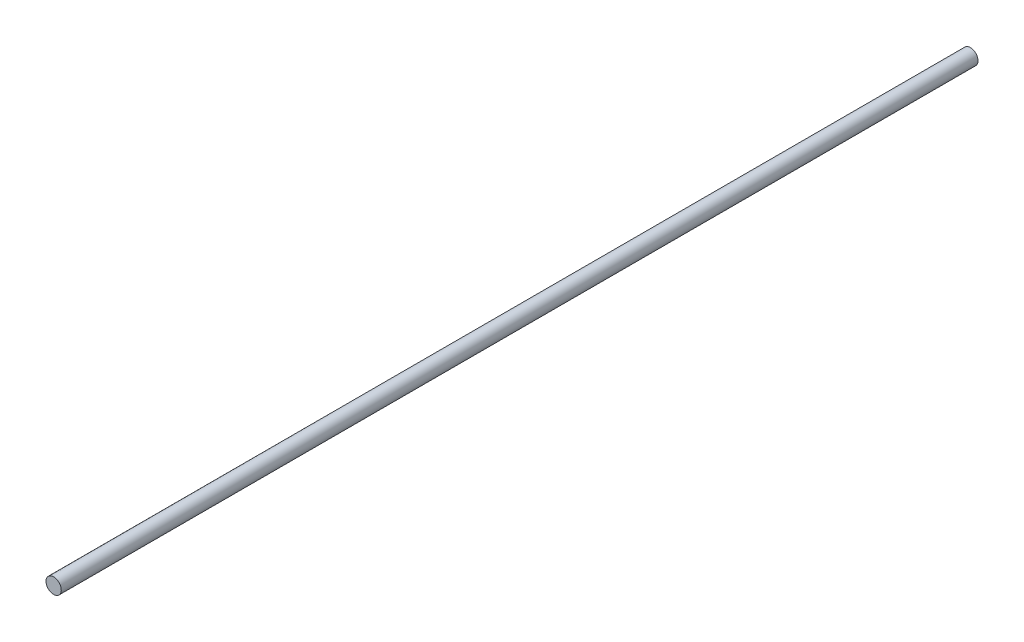
ISO-10303-21;
HEADER;
FILE_DESCRIPTION(('STEP AP214'),'2;1');
FILE_NAME('part.step','',(''),(''),'','','');
FILE_SCHEMA(('AUTOMOTIVE_DESIGN { 1 0 10303 214 1 1 1 1 }'));
ENDSEC;
DATA;
#1=APPLICATION_CONTEXT('core data for automotive mechanical design processes');
#2=APPLICATION_PROTOCOL_DEFINITION('international standard','automotive_design',2000,#1);
#3=PRODUCT_CONTEXT('',#1,'mechanical');
#4=PRODUCT('Part','Part','',(#3));
#5=PRODUCT_RELATED_PRODUCT_CATEGORY('part','',(#4));
#6=PRODUCT_DEFINITION_FORMATION('','',#4);
#7=PRODUCT_DEFINITION_CONTEXT('part definition',#1,'design');
#8=PRODUCT_DEFINITION('design','',#6,#7);
#9=PRODUCT_DEFINITION_SHAPE('','',#8);
#10=(LENGTH_UNIT() NAMED_UNIT(*) SI_UNIT(.MILLI.,.METRE.));
#11=(NAMED_UNIT(*) PLANE_ANGLE_UNIT() SI_UNIT($,.RADIAN.));
#12=(NAMED_UNIT(*) SI_UNIT($,.STERADIAN.) SOLID_ANGLE_UNIT());
#13=UNCERTAINTY_MEASURE_WITH_UNIT(LENGTH_MEASURE(1.E-05),#10,'distance_accuracy_value','');
#14=(GEOMETRIC_REPRESENTATION_CONTEXT(3) GLOBAL_UNCERTAINTY_ASSIGNED_CONTEXT((#13)) GLOBAL_UNIT_ASSIGNED_CONTEXT((#10,
#11,#12)) REPRESENTATION_CONTEXT('',''));
#15=CARTESIAN_POINT('',(0.,0.,0.));
#16=DIRECTION('',(0.,0.,1.));
#17=DIRECTION('',(1.,0.,0.));
#18=AXIS2_PLACEMENT_3D('',#15,#16,#17);
#19=CARTESIAN_POINT('',(0.,0.,600.));
#20=DIRECTION('',(0.,0.,-1.));
#21=DIRECTION('',(-1.,0.,0.));
#22=AXIS2_PLACEMENT_3D('',#19,#20,#21);
#23=CYLINDRICAL_SURFACE('',#22,5.);
#24=CARTESIAN_POINT('',(0.,0.,600.));
#25=DIRECTION('',(0.,0.,1.));
#26=DIRECTION('',(1.,0.,0.));
#27=AXIS2_PLACEMENT_3D('',#24,#25,#26);
#28=CIRCLE('',#27,5.);
#29=CARTESIAN_POINT('',(5.,0.,600.));
#30=VERTEX_POINT('',#29);
#31=EDGE_CURVE('E10',#30,#30,#28,.T.);
#32=ORIENTED_EDGE('',*,*,#31,.F.);
#33=EDGE_LOOP('',(#32));
#34=FACE_BOUND('',#33,.T.);
#35=CARTESIAN_POINT('',(0.,0.,0.));
#36=DIRECTION('',(0.,0.,1.));
#37=DIRECTION('',(1.,0.,0.));
#38=AXIS2_PLACEMENT_3D('',#35,#36,#37);
#39=CIRCLE('',#38,5.);
#40=CARTESIAN_POINT('',(5.,0.,0.));
#41=VERTEX_POINT('',#40);
#42=EDGE_CURVE('E39',#41,#41,#39,.T.);
#43=ORIENTED_EDGE('',*,*,#42,.T.);
#44=EDGE_LOOP('',(#43));
#45=FACE_BOUND('',#44,.T.);
#46=ADVANCED_FACE('F36',(#34,#45),#23,.T.);
#47=CARTESIAN_POINT('',(0.,0.,600.));
#48=DIRECTION('',(0.,0.,1.));
#49=DIRECTION('',(1.,0.,0.));
#50=AXIS2_PLACEMENT_3D('',#47,#48,#49);
#51=PLANE('',#50);
#52=ORIENTED_EDGE('',*,*,#31,.T.);
#53=EDGE_LOOP('',(#52));
#54=FACE_BOUND('',#53,.T.);
#55=ADVANCED_FACE('F51',(#54),#51,.T.);
#56=CARTESIAN_POINT('',(0.,0.,0.));
#57=DIRECTION('',(0.,0.,1.));
#58=DIRECTION('',(1.,0.,0.));
#59=AXIS2_PLACEMENT_3D('',#56,#57,#58);
#60=PLANE('',#59);
#61=ORIENTED_EDGE('',*,*,#42,.F.);
#62=EDGE_LOOP('',(#61));
#63=FACE_BOUND('',#62,.T.);
#64=ADVANCED_FACE('F49',(#63),#60,.F.);
#65=CLOSED_SHELL('',(#46,#55,#64));
#66=MANIFOLD_SOLID_BREP('B2',#65);
#67=ADVANCED_BREP_SHAPE_REPRESENTATION('',(#18,#66),#14);
#68=SHAPE_DEFINITION_REPRESENTATION(#9,#67);
ENDSEC;
END-ISO-10303-21;
